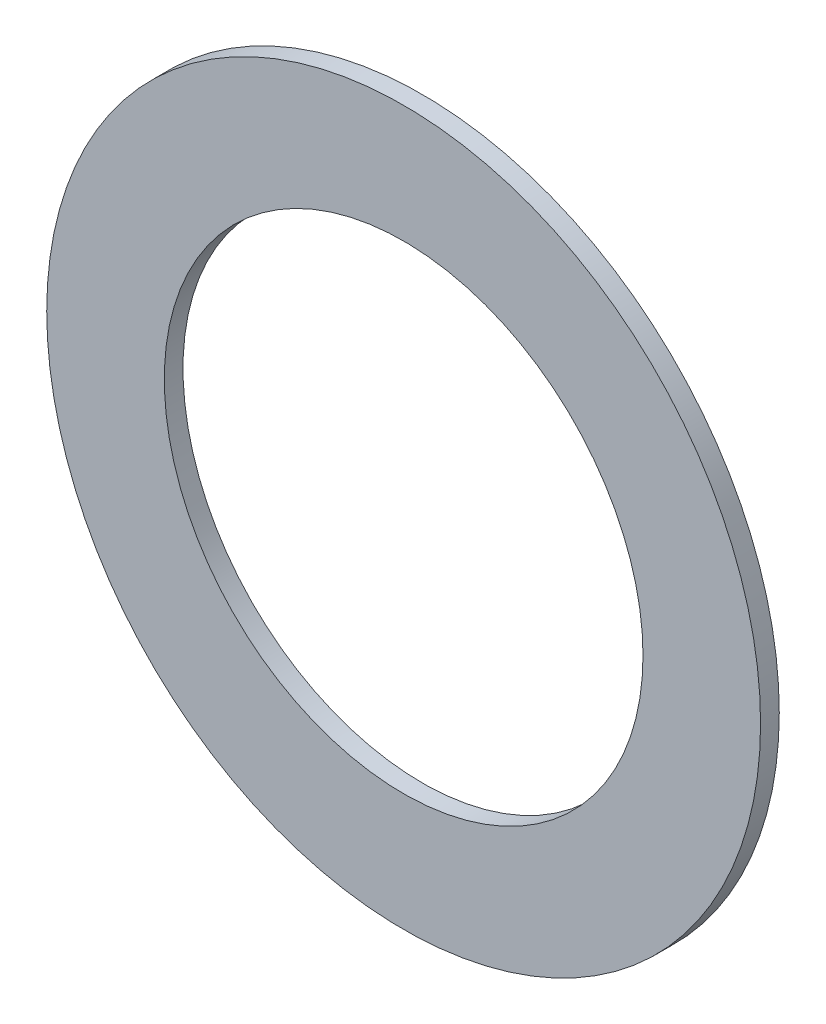
ISO-10303-21;
HEADER;
FILE_DESCRIPTION(('STEP AP214'),'2;1');
FILE_NAME('part.step','',(''),(''),'','','');
FILE_SCHEMA(('AUTOMOTIVE_DESIGN { 1 0 10303 214 1 1 1 1 }'));
ENDSEC;
DATA;
#1=APPLICATION_CONTEXT('core data for automotive mechanical design processes');
#2=APPLICATION_PROTOCOL_DEFINITION('international standard','automotive_design',2000,#1);
#3=PRODUCT_CONTEXT('',#1,'mechanical');
#4=PRODUCT('Part','Part','',(#3));
#5=PRODUCT_RELATED_PRODUCT_CATEGORY('part','',(#4));
#6=PRODUCT_DEFINITION_FORMATION('','',#4);
#7=PRODUCT_DEFINITION_CONTEXT('part definition',#1,'design');
#8=PRODUCT_DEFINITION('design','',#6,#7);
#9=PRODUCT_DEFINITION_SHAPE('','',#8);
#10=(LENGTH_UNIT() NAMED_UNIT(*) SI_UNIT(.MILLI.,.METRE.));
#11=(NAMED_UNIT(*) PLANE_ANGLE_UNIT() SI_UNIT($,.RADIAN.));
#12=(NAMED_UNIT(*) SI_UNIT($,.STERADIAN.) SOLID_ANGLE_UNIT());
#13=UNCERTAINTY_MEASURE_WITH_UNIT(LENGTH_MEASURE(1.E-05),#10,'distance_accuracy_value','');
#14=(GEOMETRIC_REPRESENTATION_CONTEXT(3) GLOBAL_UNCERTAINTY_ASSIGNED_CONTEXT((#13)) GLOBAL_UNIT_ASSIGNED_CONTEXT((#10,
#11,#12)) REPRESENTATION_CONTEXT('',''));
#15=CARTESIAN_POINT('',(0.,0.,0.));
#16=DIRECTION('',(0.,0.,1.));
#17=DIRECTION('',(1.,0.,0.));
#18=AXIS2_PLACEMENT_3D('',#15,#16,#17);
#19=CARTESIAN_POINT('',(0.,0.,4.));
#20=DIRECTION('',(0.,0.,-1.));
#21=DIRECTION('',(-1.,0.,0.));
#22=AXIS2_PLACEMENT_3D('',#19,#20,#21);
#23=CYLINDRICAL_SURFACE('',#22,51.2);
#24=CARTESIAN_POINT('',(0.,0.,4.));
#25=DIRECTION('',(0.,0.,1.));
#26=DIRECTION('',(1.,0.,0.));
#27=AXIS2_PLACEMENT_3D('',#24,#25,#26);
#28=CIRCLE('',#27,51.2);
#29=CARTESIAN_POINT('',(51.2,0.,4.));
#30=VERTEX_POINT('',#29);
#31=EDGE_CURVE('E42',#30,#30,#28,.T.);
#32=ORIENTED_EDGE('',*,*,#31,.T.);
#33=EDGE_LOOP('',(#32));
#34=FACE_BOUND('',#33,.T.);
#35=CARTESIAN_POINT('',(0.,0.,0.));
#36=DIRECTION('',(0.,0.,1.));
#37=DIRECTION('',(1.,0.,0.));
#38=AXIS2_PLACEMENT_3D('',#35,#36,#37);
#39=CIRCLE('',#38,51.2);
#40=CARTESIAN_POINT('',(51.2,0.,0.));
#41=VERTEX_POINT('',#40);
#42=EDGE_CURVE('E48',#41,#41,#39,.T.);
#43=ORIENTED_EDGE('',*,*,#42,.F.);
#44=EDGE_LOOP('',(#43));
#45=FACE_BOUND('',#44,.T.);
#46=ADVANCED_FACE('F35',(#34,#45),#23,.F.);
#47=CARTESIAN_POINT('',(0.,0.,4.));
#48=DIRECTION('',(0.,0.,-1.));
#49=DIRECTION('',(-1.,0.,0.));
#50=AXIS2_PLACEMENT_3D('',#47,#48,#49);
#51=CYLINDRICAL_SURFACE('',#50,76.35);
#52=CARTESIAN_POINT('',(0.,0.,4.));
#53=DIRECTION('',(0.,0.,1.));
#54=DIRECTION('',(1.,0.,0.));
#55=AXIS2_PLACEMENT_3D('',#52,#53,#54);
#56=CIRCLE('',#55,76.35);
#57=CARTESIAN_POINT('',(76.35,0.,4.));
#58=VERTEX_POINT('',#57);
#59=EDGE_CURVE('E10',#58,#58,#56,.T.);
#60=ORIENTED_EDGE('',*,*,#59,.F.);
#61=EDGE_LOOP('',(#60));
#62=FACE_BOUND('',#61,.T.);
#63=CARTESIAN_POINT('',(0.,0.,0.));
#64=DIRECTION('',(0.,0.,1.));
#65=DIRECTION('',(1.,0.,0.));
#66=AXIS2_PLACEMENT_3D('',#63,#64,#65);
#67=CIRCLE('',#66,76.35);
#68=CARTESIAN_POINT('',(76.35,0.,0.));
#69=VERTEX_POINT('',#68);
#70=EDGE_CURVE('E38',#69,#69,#67,.T.);
#71=ORIENTED_EDGE('',*,*,#70,.T.);
#72=EDGE_LOOP('',(#71));
#73=FACE_BOUND('',#72,.T.);
#74=ADVANCED_FACE('F55',(#62,#73),#51,.T.);
#75=CARTESIAN_POINT('',(0.,0.,4.));
#76=DIRECTION('',(0.,0.,1.));
#77=DIRECTION('',(1.,0.,0.));
#78=AXIS2_PLACEMENT_3D('',#75,#76,#77);
#79=PLANE('',#78);
#80=ORIENTED_EDGE('',*,*,#31,.F.);
#81=EDGE_LOOP('',(#80));
#82=FACE_BOUND('',#81,.T.);
#83=ORIENTED_EDGE('',*,*,#59,.T.);
#84=EDGE_LOOP('',(#83));
#85=FACE_BOUND('',#84,.T.);
#86=ADVANCED_FACE('F59',(#82,#85),#79,.T.);
#87=CARTESIAN_POINT('',(0.,0.,0.));
#88=DIRECTION('',(0.,0.,1.));
#89=DIRECTION('',(1.,0.,0.));
#90=AXIS2_PLACEMENT_3D('',#87,#88,#89);
#91=PLANE('',#90);
#92=ORIENTED_EDGE('',*,*,#42,.T.);
#93=EDGE_LOOP('',(#92));
#94=FACE_BOUND('',#93,.T.);
#95=ORIENTED_EDGE('',*,*,#70,.F.);
#96=EDGE_LOOP('',(#95));
#97=FACE_BOUND('',#96,.T.);
#98=ADVANCED_FACE('F57',(#94,#97),#91,.F.);
#99=CLOSED_SHELL('',(#46,#74,#86,#98));
#100=MANIFOLD_SOLID_BREP('B2',#99);
#101=ADVANCED_BREP_SHAPE_REPRESENTATION('',(#18,#100),#14);
#102=SHAPE_DEFINITION_REPRESENTATION(#9,#101);
ENDSEC;
END-ISO-10303-21;
